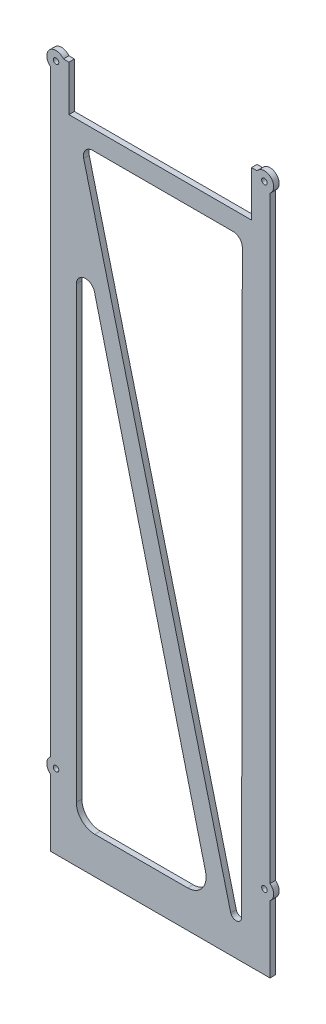
ISO-10303-21;
HEADER;
FILE_DESCRIPTION(('STEP AP214'),'2;1');
FILE_NAME('part.step','',(''),(''),'','','');
FILE_SCHEMA(('AUTOMOTIVE_DESIGN { 1 0 10303 214 1 1 1 1 }'));
ENDSEC;
DATA;
#1=APPLICATION_CONTEXT('core data for automotive mechanical design processes');
#2=APPLICATION_PROTOCOL_DEFINITION('international standard','automotive_design',2000,#1);
#3=PRODUCT_CONTEXT('',#1,'mechanical');
#4=PRODUCT('Part','Part','',(#3));
#5=PRODUCT_RELATED_PRODUCT_CATEGORY('part','',(#4));
#6=PRODUCT_DEFINITION_FORMATION('','',#4);
#7=PRODUCT_DEFINITION_CONTEXT('part definition',#1,'design');
#8=PRODUCT_DEFINITION('design','',#6,#7);
#9=PRODUCT_DEFINITION_SHAPE('','',#8);
#10=(LENGTH_UNIT() NAMED_UNIT(*) SI_UNIT(.MILLI.,.METRE.));
#11=(NAMED_UNIT(*) PLANE_ANGLE_UNIT() SI_UNIT($,.RADIAN.));
#12=(NAMED_UNIT(*) SI_UNIT($,.STERADIAN.) SOLID_ANGLE_UNIT());
#13=UNCERTAINTY_MEASURE_WITH_UNIT(LENGTH_MEASURE(1.E-05),#10,'distance_accuracy_value','');
#14=(GEOMETRIC_REPRESENTATION_CONTEXT(3) GLOBAL_UNCERTAINTY_ASSIGNED_CONTEXT((#13)) GLOBAL_UNIT_ASSIGNED_CONTEXT((#10,
#11,#12)) REPRESENTATION_CONTEXT('',''));
#15=CARTESIAN_POINT('',(0.,0.,0.));
#16=DIRECTION('',(0.,0.,1.));
#17=DIRECTION('',(1.,0.,0.));
#18=AXIS2_PLACEMENT_3D('',#15,#16,#17);
#19=CARTESIAN_POINT('',(0.,-332.18,3.));
#20=DIRECTION('',(0.,0.,-1.));
#21=DIRECTION('',(-1.,0.,0.));
#22=AXIS2_PLACEMENT_3D('',#19,#20,#21);
#23=PLANE('',#22);
#24=CARTESIAN_POINT('',(71.3854792729293,-342.524894505315,3.));
#25=DIRECTION('',(0.,0.,1.));
#26=DIRECTION('',(-1.,0.,0.));
#27=AXIS2_PLACEMENT_3D('',#24,#25,#26);
#28=CIRCLE('',#27,10.);
#29=CARTESIAN_POINT('',(71.3854792729292,-352.524894505315,3.));
#30=VERTEX_POINT('',#29);
#31=CARTESIAN_POINT('',(81.0898729954204,-340.111444178734,3.));
#32=VERTEX_POINT('',#31);
#33=EDGE_CURVE('E282',#30,#32,#28,.T.);
#34=ORIENTED_EDGE('',*,*,#33,.F.);
#35=DIRECTION('',(1.,0.,0.));
#36=VECTOR('',#35,1.);
#37=CARTESIAN_POINT('',(21.0000000000001,-352.524894505315,3.));
#38=LINE('',#37,#36);
#39=CARTESIAN_POINT('',(21.0000000000001,-352.524894505315,3.));
#40=VERTEX_POINT('',#39);
#41=EDGE_CURVE('E299',#40,#30,#38,.T.);
#42=ORIENTED_EDGE('',*,*,#41,.F.);
#43=CARTESIAN_POINT('',(21.,-342.524894505315,3.));
#44=DIRECTION('',(0.,0.,1.));
#45=DIRECTION('',(-1.,0.,0.));
#46=AXIS2_PLACEMENT_3D('',#43,#44,#45);
#47=CIRCLE('',#46,10.);
#48=CARTESIAN_POINT('',(11.,-342.524894505315,3.));
#49=VERTEX_POINT('',#48);
#50=EDGE_CURVE('E295',#49,#40,#47,.T.);
#51=ORIENTED_EDGE('',*,*,#50,.F.);
#52=DIRECTION('',(0.,-1.,0.));
#53=VECTOR('',#52,1.);
#54=CARTESIAN_POINT('',(11.,-99.1045016043882,3.));
#55=LINE('',#54,#53);
#56=CARTESIAN_POINT('',(11.,-99.1045016043882,3.));
#57=VERTEX_POINT('',#56);
#58=EDGE_CURVE('E292',#57,#49,#55,.T.);
#59=ORIENTED_EDGE('',*,*,#58,.F.);
#60=CARTESIAN_POINT('',(16.,-99.1045016043871,3.));
#61=DIRECTION('',(0.,0.,1.));
#62=DIRECTION('',(-1.,0.,0.));
#63=AXIS2_PLACEMENT_3D('',#60,#61,#62);
#64=CIRCLE('',#63,5.);
#65=CARTESIAN_POINT('',(20.8465926277075,-97.8754613686538,3.));
#66=VERTEX_POINT('',#65);
#67=EDGE_CURVE('E289',#66,#57,#64,.T.);
#68=ORIENTED_EDGE('',*,*,#67,.F.);
#69=DIRECTION('',(-0.24134503265812,0.970439372249112,0.));
#70=VECTOR('',#69,1.);
#71=CARTESIAN_POINT('',(81.0898729954204,-340.111444178734,3.));
#72=LINE('',#71,#70);
#73=EDGE_CURVE('E285',#32,#66,#72,.T.);
#74=ORIENTED_EDGE('',*,*,#73,.F.);
#75=EDGE_LOOP('',(#34,#42,#51,#59,#68,#74));
#76=FACE_BOUND('',#75,.T.);
#77=DIRECTION('',(1.,0.,0.));
#78=VECTOR('',#77,1.);
#79=CARTESIAN_POINT('',(116.,-372.501331749397,3.));
#80=LINE('',#79,#78);
#81=CARTESIAN_POINT('',(-3.,-372.501331749397,3.));
#82=VERTEX_POINT('',#81);
#83=CARTESIAN_POINT('',(116.,-372.501331749397,3.));
#84=VERTEX_POINT('',#83);
#85=EDGE_CURVE('E377',#82,#84,#80,.T.);
#86=ORIENTED_EDGE('',*,*,#85,.T.);
#87=DIRECTION('',(0.,1.,0.));
#88=VECTOR('',#87,1.);
#89=CARTESIAN_POINT('',(116.,-372.501331749397,3.));
#90=LINE('',#89,#88);
#91=CARTESIAN_POINT('',(116.,-336.18,3.));
#92=VERTEX_POINT('',#91);
#93=EDGE_CURVE('E381',#84,#92,#90,.T.);
#94=ORIENTED_EDGE('',*,*,#93,.T.);
#95=CARTESIAN_POINT('',(113.,-332.18,3.));
#96=DIRECTION('',(0.,0.,1.));
#97=DIRECTION('',(1.,0.,0.));
#98=AXIS2_PLACEMENT_3D('',#95,#96,#97);
#99=CIRCLE('',#98,5.00000000000002);
#100=CARTESIAN_POINT('',(116.,-328.18,3.));
#101=VERTEX_POINT('',#100);
#102=EDGE_CURVE('E385',#92,#101,#99,.T.);
#103=ORIENTED_EDGE('',*,*,#102,.T.);
#104=DIRECTION('',(0.,1.,0.));
#105=VECTOR('',#104,1.);
#106=CARTESIAN_POINT('',(116.,-328.18,3.));
#107=LINE('',#106,#105);
#108=CARTESIAN_POINT('',(116.,-4.,3.));
#109=VERTEX_POINT('',#108);
#110=EDGE_CURVE('E388',#101,#109,#107,.T.);
#111=ORIENTED_EDGE('',*,*,#110,.T.);
#112=CARTESIAN_POINT('',(113.,0.,3.));
#113=DIRECTION('',(0.,0.,1.));
#114=DIRECTION('',(-1.,0.,0.));
#115=AXIS2_PLACEMENT_3D('',#112,#113,#114);
#116=CIRCLE('',#115,5.);
#117=CARTESIAN_POINT('',(109.,3.,3.));
#118=VERTEX_POINT('',#117);
#119=EDGE_CURVE('E391',#109,#118,#116,.T.);
#120=ORIENTED_EDGE('',*,*,#119,.T.);
#121=DIRECTION('',(-1.,0.,0.));
#122=VECTOR('',#121,1.);
#123=CARTESIAN_POINT('',(106.,3.,3.));
#124=LINE('',#123,#122);
#125=CARTESIAN_POINT('',(106.,3.,3.));
#126=VERTEX_POINT('',#125);
#127=EDGE_CURVE('E394',#118,#126,#124,.T.);
#128=ORIENTED_EDGE('',*,*,#127,.T.);
#129=DIRECTION('',(0.,-1.,0.));
#130=VECTOR('',#129,1.);
#131=CARTESIAN_POINT('',(106.,-21.6457553485476,3.));
#132=LINE('',#131,#130);
#133=CARTESIAN_POINT('',(106.,-21.6457553485476,3.));
#134=VERTEX_POINT('',#133);
#135=EDGE_CURVE('E397',#126,#134,#132,.T.);
#136=ORIENTED_EDGE('',*,*,#135,.T.);
#137=DIRECTION('',(-1.,0.,0.));
#138=VECTOR('',#137,1.);
#139=CARTESIAN_POINT('',(7.,-21.6457553485476,3.));
#140=LINE('',#139,#138);
#141=CARTESIAN_POINT('',(7.,-21.6457553485476,3.));
#142=VERTEX_POINT('',#141);
#143=EDGE_CURVE('E400',#134,#142,#140,.T.);
#144=ORIENTED_EDGE('',*,*,#143,.T.);
#145=DIRECTION('',(0.,1.,0.));
#146=VECTOR('',#145,1.);
#147=CARTESIAN_POINT('',(7.,3.,3.));
#148=LINE('',#147,#146);
#149=CARTESIAN_POINT('',(7.,3.,3.));
#150=VERTEX_POINT('',#149);
#151=EDGE_CURVE('E403',#142,#150,#148,.T.);
#152=ORIENTED_EDGE('',*,*,#151,.T.);
#153=DIRECTION('',(-1.,0.,0.));
#154=VECTOR('',#153,1.);
#155=CARTESIAN_POINT('',(7.,3.,3.));
#156=LINE('',#155,#154);
#157=CARTESIAN_POINT('',(4.,3.,3.));
#158=VERTEX_POINT('',#157);
#159=EDGE_CURVE('E406',#150,#158,#156,.T.);
#160=ORIENTED_EDGE('',*,*,#159,.T.);
#161=CARTESIAN_POINT('',(0.,0.,3.));
#162=DIRECTION('',(0.,0.,1.));
#163=DIRECTION('',(1.,0.,0.));
#164=AXIS2_PLACEMENT_3D('',#161,#162,#163);
#165=CIRCLE('',#164,5.);
#166=CARTESIAN_POINT('',(-3.,-4.,3.));
#167=VERTEX_POINT('',#166);
#168=EDGE_CURVE('E409',#158,#167,#165,.T.);
#169=ORIENTED_EDGE('',*,*,#168,.T.);
#170=DIRECTION('',(0.,-1.,0.));
#171=VECTOR('',#170,1.);
#172=CARTESIAN_POINT('',(-3.,-4.,3.));
#173=LINE('',#172,#171);
#174=CARTESIAN_POINT('',(-3.,-328.18,3.));
#175=VERTEX_POINT('',#174);
#176=EDGE_CURVE('E412',#167,#175,#173,.T.);
#177=ORIENTED_EDGE('',*,*,#176,.T.);
#178=CARTESIAN_POINT('',(0.,-332.18,3.));
#179=DIRECTION('',(0.,0.,1.));
#180=DIRECTION('',(-1.,0.,0.));
#181=AXIS2_PLACEMENT_3D('',#178,#179,#180);
#182=CIRCLE('',#181,4.99999999999995);
#183=CARTESIAN_POINT('',(-3.,-336.18,3.));
#184=VERTEX_POINT('',#183);
#185=EDGE_CURVE('E415',#175,#184,#182,.T.);
#186=ORIENTED_EDGE('',*,*,#185,.T.);
#187=DIRECTION('',(0.,-1.,0.));
#188=VECTOR('',#187,1.);
#189=CARTESIAN_POINT('',(-3.,-336.18,3.));
#190=LINE('',#189,#188);
#191=EDGE_CURVE('E418',#184,#82,#190,.T.);
#192=ORIENTED_EDGE('',*,*,#191,.T.);
#193=EDGE_LOOP('',(#86,#94,#103,#111,#120,#128,#136,#144,#152,#160,#169,#177,#186,#192));
#194=FACE_BOUND('',#193,.T.);
#195=CARTESIAN_POINT('',(0.,0.,3.));
#196=DIRECTION('',(0.,0.,1.));
#197=DIRECTION('',(1.,0.,0.));
#198=AXIS2_PLACEMENT_3D('',#195,#196,#197);
#199=CIRCLE('',#198,1.5);
#200=CARTESIAN_POINT('',(1.5,0.,3.));
#201=VERTEX_POINT('',#200);
#202=EDGE_CURVE('E369',#201,#201,#199,.T.);
#203=ORIENTED_EDGE('',*,*,#202,.F.);
#204=EDGE_LOOP('',(#203));
#205=FACE_BOUND('',#204,.T.);
#206=CARTESIAN_POINT('',(113.,0.,3.));
#207=DIRECTION('',(0.,0.,1.));
#208=DIRECTION('',(1.,0.,0.));
#209=AXIS2_PLACEMENT_3D('',#206,#207,#208);
#210=CIRCLE('',#209,1.5);
#211=CARTESIAN_POINT('',(114.5,0.,3.));
#212=VERTEX_POINT('',#211);
#213=EDGE_CURVE('E361',#212,#212,#210,.T.);
#214=ORIENTED_EDGE('',*,*,#213,.F.);
#215=EDGE_LOOP('',(#214));
#216=FACE_BOUND('',#215,.T.);
#217=CARTESIAN_POINT('',(0.,-332.18,3.));
#218=DIRECTION('',(0.,0.,1.));
#219=DIRECTION('',(1.,0.,0.));
#220=AXIS2_PLACEMENT_3D('',#217,#218,#219);
#221=CIRCLE('',#220,1.5);
#222=CARTESIAN_POINT('',(1.5,-332.18,3.));
#223=VERTEX_POINT('',#222);
#224=EDGE_CURVE('E353',#223,#223,#221,.T.);
#225=ORIENTED_EDGE('',*,*,#224,.F.);
#226=EDGE_LOOP('',(#225));
#227=FACE_BOUND('',#226,.T.);
#228=CARTESIAN_POINT('',(113.,-332.18,3.));
#229=DIRECTION('',(0.,0.,1.));
#230=DIRECTION('',(1.,0.,0.));
#231=AXIS2_PLACEMENT_3D('',#228,#229,#230);
#232=CIRCLE('',#231,1.5);
#233=CARTESIAN_POINT('',(114.5,-332.18,3.));
#234=VERTEX_POINT('',#233);
#235=EDGE_CURVE('E345',#234,#234,#232,.T.);
#236=ORIENTED_EDGE('',*,*,#235,.F.);
#237=EDGE_LOOP('',(#236));
#238=FACE_BOUND('',#237,.T.);
#239=CARTESIAN_POINT('',(95.9881575475294,-37.,3.));
#240=DIRECTION('',(0.,0.,1.));
#241=DIRECTION('',(1.,0.,0.));
#242=AXIS2_PLACEMENT_3D('',#239,#240,#241);
#243=CIRCLE('',#242,5.);
#244=CARTESIAN_POINT('',(100.988154045587,-37.0059177201458,3.));
#245=VERTEX_POINT('',#244);
#246=CARTESIAN_POINT('',(95.9881575475294,-32.,3.));
#247=VERTEX_POINT('',#246);
#248=EDGE_CURVE('E213',#245,#247,#243,.T.);
#249=ORIENTED_EDGE('',*,*,#248,.F.);
#250=DIRECTION('',(0.00118354402914554,0.99999929961152,0.));
#251=VECTOR('',#250,1.);
#252=CARTESIAN_POINT('',(100.988154045587,-37.0059177201458,3.));
#253=LINE('',#252,#251);
#254=CARTESIAN_POINT('',(100.615591755203,-351.791020995962,3.));
#255=VERTEX_POINT('',#254);
#256=EDGE_CURVE('E248',#255,#245,#253,.T.);
#257=ORIENTED_EDGE('',*,*,#256,.F.);
#258=CARTESIAN_POINT('',(97.6155938563681,-351.787470363874,3.));
#259=DIRECTION('',(0.,0.,1.));
#260=DIRECTION('',(-1.,0.,0.));
#261=AXIS2_PLACEMENT_3D('',#258,#259,#260);
#262=CIRCLE('',#261,3.);
#263=CARTESIAN_POINT('',(94.7076382797437,-352.524894505315,3.));
#264=VERTEX_POINT('',#263);
#265=EDGE_CURVE('E245',#264,#255,#262,.T.);
#266=ORIENTED_EDGE('',*,*,#265,.F.);
#267=DIRECTION('',(0.245808047146874,-0.969318525541445,0.));
#268=VECTOR('',#267,1.);
#269=CARTESIAN_POINT('',(94.7076382797437,-352.524894505315,3.));
#270=LINE('',#269,#268);
#271=CARTESIAN_POINT('',(15.0058187759744,-38.2290402357344,3.));
#272=VERTEX_POINT('',#271);
#273=EDGE_CURVE('E240',#272,#264,#270,.T.);
#274=ORIENTED_EDGE('',*,*,#273,.F.);
#275=CARTESIAN_POINT('',(19.8524114036816,-37.,3.));
#276=DIRECTION('',(0.,0.,1.));
#277=DIRECTION('',(-1.,0.,0.));
#278=AXIS2_PLACEMENT_3D('',#275,#276,#277);
#279=CIRCLE('',#278,5.);
#280=CARTESIAN_POINT('',(19.8524114036817,-32.,3.));
#281=VERTEX_POINT('',#280);
#282=EDGE_CURVE('E236',#281,#272,#279,.T.);
#283=ORIENTED_EDGE('',*,*,#282,.F.);
#284=DIRECTION('',(-1.,0.,0.));
#285=VECTOR('',#284,1.);
#286=CARTESIAN_POINT('',(19.8524114036817,-32.,3.));
#287=LINE('',#286,#285);
#288=EDGE_CURVE('E222',#247,#281,#287,.T.);
#289=ORIENTED_EDGE('',*,*,#288,.F.);
#290=EDGE_LOOP('',(#249,#257,#266,#274,#283,#289));
#291=FACE_BOUND('',#290,.T.);
#292=ADVANCED_FACE('F39',(#76,#194,#205,#216,#227,#238,#291),#23,.F.);
#293=CARTESIAN_POINT('',(0.,-332.18,0.));
#294=DIRECTION('',(0.,0.,-1.));
#295=DIRECTION('',(-1.,0.,0.));
#296=AXIS2_PLACEMENT_3D('',#293,#294,#295);
#297=PLANE('',#296);
#298=CARTESIAN_POINT('',(0.,-332.18,0.));
#299=DIRECTION('',(0.,0.,1.));
#300=DIRECTION('',(1.,0.,0.));
#301=AXIS2_PLACEMENT_3D('',#298,#299,#300);
#302=CIRCLE('',#301,1.5);
#303=CARTESIAN_POINT('',(1.5,-332.18,0.));
#304=VERTEX_POINT('',#303);
#305=EDGE_CURVE('E349',#304,#304,#302,.T.);
#306=ORIENTED_EDGE('',*,*,#305,.T.);
#307=EDGE_LOOP('',(#306));
#308=FACE_BOUND('',#307,.T.);
#309=CARTESIAN_POINT('',(0.,0.,0.));
#310=DIRECTION('',(0.,0.,1.));
#311=DIRECTION('',(1.,0.,0.));
#312=AXIS2_PLACEMENT_3D('',#309,#310,#311);
#313=CIRCLE('',#312,1.5);
#314=CARTESIAN_POINT('',(1.5,0.,0.));
#315=VERTEX_POINT('',#314);
#316=EDGE_CURVE('E365',#315,#315,#313,.T.);
#317=ORIENTED_EDGE('',*,*,#316,.T.);
#318=EDGE_LOOP('',(#317));
#319=FACE_BOUND('',#318,.T.);
#320=DIRECTION('',(1.,0.,0.));
#321=VECTOR('',#320,1.);
#322=CARTESIAN_POINT('',(116.,-372.501331749397,0.));
#323=LINE('',#322,#321);
#324=CARTESIAN_POINT('',(-3.,-372.501331749397,0.));
#325=VERTEX_POINT('',#324);
#326=CARTESIAN_POINT('',(116.,-372.501331749397,0.));
#327=VERTEX_POINT('',#326);
#328=EDGE_CURVE('E373',#325,#327,#323,.T.);
#329=ORIENTED_EDGE('',*,*,#328,.F.);
#330=DIRECTION('',(0.,-1.,0.));
#331=VECTOR('',#330,1.);
#332=CARTESIAN_POINT('',(-3.,-336.18,0.));
#333=LINE('',#332,#331);
#334=CARTESIAN_POINT('',(-3.,-336.18,0.));
#335=VERTEX_POINT('',#334);
#336=EDGE_CURVE('E382',#335,#325,#333,.T.);
#337=ORIENTED_EDGE('',*,*,#336,.F.);
#338=CARTESIAN_POINT('',(0.,-332.18,0.));
#339=DIRECTION('',(0.,0.,1.));
#340=DIRECTION('',(-1.,0.,0.));
#341=AXIS2_PLACEMENT_3D('',#338,#339,#340);
#342=CIRCLE('',#341,4.99999999999995);
#343=CARTESIAN_POINT('',(-3.,-328.18,0.));
#344=VERTEX_POINT('',#343);
#345=EDGE_CURVE('E458',#344,#335,#342,.T.);
#346=ORIENTED_EDGE('',*,*,#345,.F.);
#347=DIRECTION('',(0.,-1.,0.));
#348=VECTOR('',#347,1.);
#349=CARTESIAN_POINT('',(-3.,-4.,0.));
#350=LINE('',#349,#348);
#351=CARTESIAN_POINT('',(-3.,-4.,0.));
#352=VERTEX_POINT('',#351);
#353=EDGE_CURVE('E455',#352,#344,#350,.T.);
#354=ORIENTED_EDGE('',*,*,#353,.F.);
#355=CARTESIAN_POINT('',(0.,0.,0.));
#356=DIRECTION('',(0.,0.,1.));
#357=DIRECTION('',(1.,0.,0.));
#358=AXIS2_PLACEMENT_3D('',#355,#356,#357);
#359=CIRCLE('',#358,5.);
#360=CARTESIAN_POINT('',(4.,3.,0.));
#361=VERTEX_POINT('',#360);
#362=EDGE_CURVE('E452',#361,#352,#359,.T.);
#363=ORIENTED_EDGE('',*,*,#362,.F.);
#364=DIRECTION('',(-1.,0.,0.));
#365=VECTOR('',#364,1.);
#366=CARTESIAN_POINT('',(7.,3.,0.));
#367=LINE('',#366,#365);
#368=CARTESIAN_POINT('',(7.,3.,0.));
#369=VERTEX_POINT('',#368);
#370=EDGE_CURVE('E449',#369,#361,#367,.T.);
#371=ORIENTED_EDGE('',*,*,#370,.F.);
#372=DIRECTION('',(0.,1.,0.));
#373=VECTOR('',#372,1.);
#374=CARTESIAN_POINT('',(7.,3.,0.));
#375=LINE('',#374,#373);
#376=CARTESIAN_POINT('',(7.,-21.6457553485476,0.));
#377=VERTEX_POINT('',#376);
#378=EDGE_CURVE('E446',#377,#369,#375,.T.);
#379=ORIENTED_EDGE('',*,*,#378,.F.);
#380=DIRECTION('',(-1.,0.,0.));
#381=VECTOR('',#380,1.);
#382=CARTESIAN_POINT('',(7.,-21.6457553485476,0.));
#383=LINE('',#382,#381);
#384=CARTESIAN_POINT('',(106.,-21.6457553485476,0.));
#385=VERTEX_POINT('',#384);
#386=EDGE_CURVE('E443',#385,#377,#383,.T.);
#387=ORIENTED_EDGE('',*,*,#386,.F.);
#388=DIRECTION('',(0.,-1.,0.));
#389=VECTOR('',#388,1.);
#390=CARTESIAN_POINT('',(106.,-21.6457553485476,0.));
#391=LINE('',#390,#389);
#392=CARTESIAN_POINT('',(106.,3.,0.));
#393=VERTEX_POINT('',#392);
#394=EDGE_CURVE('E440',#393,#385,#391,.T.);
#395=ORIENTED_EDGE('',*,*,#394,.F.);
#396=DIRECTION('',(-1.,0.,0.));
#397=VECTOR('',#396,1.);
#398=CARTESIAN_POINT('',(106.,3.,0.));
#399=LINE('',#398,#397);
#400=CARTESIAN_POINT('',(109.,3.,0.));
#401=VERTEX_POINT('',#400);
#402=EDGE_CURVE('E437',#401,#393,#399,.T.);
#403=ORIENTED_EDGE('',*,*,#402,.F.);
#404=CARTESIAN_POINT('',(113.,0.,0.));
#405=DIRECTION('',(0.,0.,1.));
#406=DIRECTION('',(-1.,0.,0.));
#407=AXIS2_PLACEMENT_3D('',#404,#405,#406);
#408=CIRCLE('',#407,5.);
#409=CARTESIAN_POINT('',(116.,-4.,0.));
#410=VERTEX_POINT('',#409);
#411=EDGE_CURVE('E434',#410,#401,#408,.T.);
#412=ORIENTED_EDGE('',*,*,#411,.F.);
#413=DIRECTION('',(0.,1.,0.));
#414=VECTOR('',#413,1.);
#415=CARTESIAN_POINT('',(116.,-328.18,0.));
#416=LINE('',#415,#414);
#417=CARTESIAN_POINT('',(116.,-328.18,0.));
#418=VERTEX_POINT('',#417);
#419=EDGE_CURVE('E431',#418,#410,#416,.T.);
#420=ORIENTED_EDGE('',*,*,#419,.F.);
#421=CARTESIAN_POINT('',(113.,-332.18,0.));
#422=DIRECTION('',(0.,0.,1.));
#423=DIRECTION('',(1.,0.,0.));
#424=AXIS2_PLACEMENT_3D('',#421,#422,#423);
#425=CIRCLE('',#424,5.00000000000002);
#426=CARTESIAN_POINT('',(116.,-336.18,0.));
#427=VERTEX_POINT('',#426);
#428=EDGE_CURVE('E428',#427,#418,#425,.T.);
#429=ORIENTED_EDGE('',*,*,#428,.F.);
#430=DIRECTION('',(0.,1.,0.));
#431=VECTOR('',#430,1.);
#432=CARTESIAN_POINT('',(116.,-372.501331749397,0.));
#433=LINE('',#432,#431);
#434=EDGE_CURVE('E425',#327,#427,#433,.T.);
#435=ORIENTED_EDGE('',*,*,#434,.F.);
#436=EDGE_LOOP('',(#329,#337,#346,#354,#363,#371,#379,#387,#395,#403,#412,#420,#429,#435));
#437=FACE_BOUND('',#436,.T.);
#438=CARTESIAN_POINT('',(113.,0.,0.));
#439=DIRECTION('',(0.,0.,1.));
#440=DIRECTION('',(1.,0.,0.));
#441=AXIS2_PLACEMENT_3D('',#438,#439,#440);
#442=CIRCLE('',#441,1.5);
#443=CARTESIAN_POINT('',(114.5,0.,0.));
#444=VERTEX_POINT('',#443);
#445=EDGE_CURVE('E357',#444,#444,#442,.T.);
#446=ORIENTED_EDGE('',*,*,#445,.T.);
#447=EDGE_LOOP('',(#446));
#448=FACE_BOUND('',#447,.T.);
#449=CARTESIAN_POINT('',(113.,-332.18,0.));
#450=DIRECTION('',(0.,0.,1.));
#451=DIRECTION('',(1.,0.,0.));
#452=AXIS2_PLACEMENT_3D('',#449,#450,#451);
#453=CIRCLE('',#452,1.5);
#454=CARTESIAN_POINT('',(114.5,-332.18,0.));
#455=VERTEX_POINT('',#454);
#456=EDGE_CURVE('E344',#455,#455,#453,.T.);
#457=ORIENTED_EDGE('',*,*,#456,.T.);
#458=EDGE_LOOP('',(#457));
#459=FACE_BOUND('',#458,.T.);
#460=DIRECTION('',(1.,0.,0.));
#461=VECTOR('',#460,1.);
#462=CARTESIAN_POINT('',(21.0000000000001,-352.524894505315,0.));
#463=LINE('',#462,#461);
#464=CARTESIAN_POINT('',(21.0000000000001,-352.524894505315,0.));
#465=VERTEX_POINT('',#464);
#466=CARTESIAN_POINT('',(71.3854792729292,-352.524894505315,0.));
#467=VERTEX_POINT('',#466);
#468=EDGE_CURVE('E286',#465,#467,#463,.T.);
#469=ORIENTED_EDGE('',*,*,#468,.T.);
#470=CARTESIAN_POINT('',(71.3854792729293,-342.524894505315,0.));
#471=DIRECTION('',(0.,0.,1.));
#472=DIRECTION('',(-1.,0.,0.));
#473=AXIS2_PLACEMENT_3D('',#470,#471,#472);
#474=CIRCLE('',#473,10.);
#475=CARTESIAN_POINT('',(81.0898729954204,-340.111444178734,0.));
#476=VERTEX_POINT('',#475);
#477=EDGE_CURVE('E231',#467,#476,#474,.T.);
#478=ORIENTED_EDGE('',*,*,#477,.T.);
#479=DIRECTION('',(-0.24134503265812,0.970439372249112,0.));
#480=VECTOR('',#479,1.);
#481=CARTESIAN_POINT('',(81.0898729954204,-340.111444178734,0.));
#482=LINE('',#481,#480);
#483=CARTESIAN_POINT('',(20.8465926277075,-97.8754613686538,0.));
#484=VERTEX_POINT('',#483);
#485=EDGE_CURVE('E306',#476,#484,#482,.T.);
#486=ORIENTED_EDGE('',*,*,#485,.T.);
#487=CARTESIAN_POINT('',(16.,-99.1045016043871,0.));
#488=DIRECTION('',(0.,0.,1.));
#489=DIRECTION('',(-1.,0.,0.));
#490=AXIS2_PLACEMENT_3D('',#487,#488,#489);
#491=CIRCLE('',#490,5.);
#492=CARTESIAN_POINT('',(11.,-99.1045016043882,0.));
#493=VERTEX_POINT('',#492);
#494=EDGE_CURVE('E310',#484,#493,#491,.T.);
#495=ORIENTED_EDGE('',*,*,#494,.T.);
#496=DIRECTION('',(0.,-1.,0.));
#497=VECTOR('',#496,1.);
#498=CARTESIAN_POINT('',(11.,-99.1045016043882,0.));
#499=LINE('',#498,#497);
#500=CARTESIAN_POINT('',(11.,-342.524894505315,0.));
#501=VERTEX_POINT('',#500);
#502=EDGE_CURVE('E314',#493,#501,#499,.T.);
#503=ORIENTED_EDGE('',*,*,#502,.T.);
#504=CARTESIAN_POINT('',(21.,-342.524894505315,0.));
#505=DIRECTION('',(0.,0.,1.));
#506=DIRECTION('',(-1.,0.,0.));
#507=AXIS2_PLACEMENT_3D('',#504,#505,#506);
#508=CIRCLE('',#507,10.);
#509=EDGE_CURVE('E318',#501,#465,#508,.T.);
#510=ORIENTED_EDGE('',*,*,#509,.T.);
#511=EDGE_LOOP('',(#469,#478,#486,#495,#503,#510));
#512=FACE_BOUND('',#511,.T.);
#513=DIRECTION('',(0.00118354402914554,0.99999929961152,0.));
#514=VECTOR('',#513,1.);
#515=CARTESIAN_POINT('',(100.988154045587,-37.0059177201458,0.));
#516=LINE('',#515,#514);
#517=CARTESIAN_POINT('',(100.615591755203,-351.791020995962,0.));
#518=VERTEX_POINT('',#517);
#519=CARTESIAN_POINT('',(100.988154045587,-37.0059177201457,0.));
#520=VERTEX_POINT('',#519);
#521=EDGE_CURVE('E223',#518,#520,#516,.T.);
#522=ORIENTED_EDGE('',*,*,#521,.T.);
#523=CARTESIAN_POINT('',(95.9881575475294,-37.,0.));
#524=DIRECTION('',(0.,0.,1.));
#525=DIRECTION('',(1.,0.,0.));
#526=AXIS2_PLACEMENT_3D('',#523,#524,#525);
#527=CIRCLE('',#526,5.);
#528=CARTESIAN_POINT('',(95.9881575475294,-32.,0.));
#529=VERTEX_POINT('',#528);
#530=EDGE_CURVE('E63',#520,#529,#527,.T.);
#531=ORIENTED_EDGE('',*,*,#530,.T.);
#532=DIRECTION('',(-1.,0.,0.));
#533=VECTOR('',#532,1.);
#534=CARTESIAN_POINT('',(19.8524114036817,-32.,0.));
#535=LINE('',#534,#533);
#536=CARTESIAN_POINT('',(19.8524114036817,-32.,0.));
#537=VERTEX_POINT('',#536);
#538=EDGE_CURVE('E229',#529,#537,#535,.T.);
#539=ORIENTED_EDGE('',*,*,#538,.T.);
#540=CARTESIAN_POINT('',(19.8524114036816,-37.,0.));
#541=DIRECTION('',(0.,0.,1.));
#542=DIRECTION('',(-1.,0.,0.));
#543=AXIS2_PLACEMENT_3D('',#540,#541,#542);
#544=CIRCLE('',#543,5.);
#545=CARTESIAN_POINT('',(15.0058187759744,-38.2290402357344,0.));
#546=VERTEX_POINT('',#545);
#547=EDGE_CURVE('E255',#537,#546,#544,.T.);
#548=ORIENTED_EDGE('',*,*,#547,.T.);
#549=DIRECTION('',(0.245808047146874,-0.969318525541445,0.));
#550=VECTOR('',#549,1.);
#551=CARTESIAN_POINT('',(94.7076382797437,-352.524894505315,0.));
#552=LINE('',#551,#550);
#553=CARTESIAN_POINT('',(94.7076382797437,-352.524894505315,0.));
#554=VERTEX_POINT('',#553);
#555=EDGE_CURVE('E259',#546,#554,#552,.T.);
#556=ORIENTED_EDGE('',*,*,#555,.T.);
#557=CARTESIAN_POINT('',(97.6155938563681,-351.787470363874,0.));
#558=DIRECTION('',(0.,0.,1.));
#559=DIRECTION('',(-1.,0.,0.));
#560=AXIS2_PLACEMENT_3D('',#557,#558,#559);
#561=CIRCLE('',#560,3.);
#562=EDGE_CURVE('E263',#554,#518,#561,.T.);
#563=ORIENTED_EDGE('',*,*,#562,.T.);
#564=EDGE_LOOP('',(#522,#531,#539,#548,#556,#563));
#565=FACE_BOUND('',#564,.T.);
#566=ADVANCED_FACE('F521',(#308,#319,#437,#448,#459,#512,#565),#297,.T.);
#567=CARTESIAN_POINT('',(116.,-372.501331749397,3.));
#568=DIRECTION('',(0.,1.,0.));
#569=DIRECTION('',(0.,0.,1.));
#570=AXIS2_PLACEMENT_3D('',#567,#568,#569);
#571=PLANE('',#570);
#572=ORIENTED_EDGE('',*,*,#328,.T.);
#573=DIRECTION('',(0.,0.,-1.));
#574=VECTOR('',#573,1.);
#575=CARTESIAN_POINT('',(116.,-372.501331749397,3.));
#576=LINE('',#575,#574);
#577=EDGE_CURVE('E11',#84,#327,#576,.T.);
#578=ORIENTED_EDGE('',*,*,#577,.F.);
#579=ORIENTED_EDGE('',*,*,#85,.F.);
#580=DIRECTION('',(0.,0.,-1.));
#581=VECTOR('',#580,1.);
#582=CARTESIAN_POINT('',(-3.,-372.501331749397,3.));
#583=LINE('',#582,#581);
#584=EDGE_CURVE('E421',#82,#325,#583,.T.);
#585=ORIENTED_EDGE('',*,*,#584,.T.);
#586=EDGE_LOOP('',(#572,#578,#579,#585));
#587=FACE_BOUND('',#586,.T.);
#588=ADVANCED_FACE('F41',(#587),#571,.F.);
#589=CARTESIAN_POINT('',(116.,-372.501331749397,3.));
#590=DIRECTION('',(-1.,0.,0.));
#591=DIRECTION('',(0.,0.,1.));
#592=AXIS2_PLACEMENT_3D('',#589,#590,#591);
#593=PLANE('',#592);
#594=ORIENTED_EDGE('',*,*,#434,.T.);
#595=DIRECTION('',(0.,0.,-1.));
#596=VECTOR('',#595,1.);
#597=CARTESIAN_POINT('',(116.,-336.18,3.));
#598=LINE('',#597,#596);
#599=EDGE_CURVE('E48',#92,#427,#598,.T.);
#600=ORIENTED_EDGE('',*,*,#599,.F.);
#601=ORIENTED_EDGE('',*,*,#93,.F.);
#602=ORIENTED_EDGE('',*,*,#577,.T.);
#603=EDGE_LOOP('',(#594,#600,#601,#602));
#604=FACE_BOUND('',#603,.T.);
#605=ADVANCED_FACE('F539',(#604),#593,.F.);
#606=CARTESIAN_POINT('',(113.,-332.18,3.));
#607=DIRECTION('',(0.,0.,-1.));
#608=DIRECTION('',(-1.,0.,0.));
#609=AXIS2_PLACEMENT_3D('',#606,#607,#608);
#610=CYLINDRICAL_SURFACE('',#609,5.00000000000002);
#611=ORIENTED_EDGE('',*,*,#428,.T.);
#612=DIRECTION('',(0.,0.,-1.));
#613=VECTOR('',#612,1.);
#614=CARTESIAN_POINT('',(116.,-328.18,3.));
#615=LINE('',#614,#613);
#616=EDGE_CURVE('E506',#101,#418,#615,.T.);
#617=ORIENTED_EDGE('',*,*,#616,.F.);
#618=ORIENTED_EDGE('',*,*,#102,.F.);
#619=ORIENTED_EDGE('',*,*,#599,.T.);
#620=EDGE_LOOP('',(#611,#617,#618,#619));
#621=FACE_BOUND('',#620,.T.);
#622=ADVANCED_FACE('F515',(#621),#610,.T.);
#623=CARTESIAN_POINT('',(116.,-328.18,3.));
#624=DIRECTION('',(-1.,0.,0.));
#625=DIRECTION('',(0.,-1.,0.));
#626=AXIS2_PLACEMENT_3D('',#623,#624,#625);
#627=PLANE('',#626);
#628=ORIENTED_EDGE('',*,*,#419,.T.);
#629=DIRECTION('',(0.,0.,-1.));
#630=VECTOR('',#629,1.);
#631=CARTESIAN_POINT('',(116.,-4.,3.));
#632=LINE('',#631,#630);
#633=EDGE_CURVE('E502',#109,#410,#632,.T.);
#634=ORIENTED_EDGE('',*,*,#633,.F.);
#635=ORIENTED_EDGE('',*,*,#110,.F.);
#636=ORIENTED_EDGE('',*,*,#616,.T.);
#637=EDGE_LOOP('',(#628,#634,#635,#636));
#638=FACE_BOUND('',#637,.T.);
#639=ADVANCED_FACE('F527',(#638),#627,.F.);
#640=CARTESIAN_POINT('',(113.,0.,3.));
#641=DIRECTION('',(0.,0.,-1.));
#642=DIRECTION('',(-1.,0.,0.));
#643=AXIS2_PLACEMENT_3D('',#640,#641,#642);
#644=CYLINDRICAL_SURFACE('',#643,5.);
#645=ORIENTED_EDGE('',*,*,#411,.T.);
#646=DIRECTION('',(0.,0.,-1.));
#647=VECTOR('',#646,1.);
#648=CARTESIAN_POINT('',(109.,3.,3.));
#649=LINE('',#648,#647);
#650=EDGE_CURVE('E498',#118,#401,#649,.T.);
#651=ORIENTED_EDGE('',*,*,#650,.F.);
#652=ORIENTED_EDGE('',*,*,#119,.F.);
#653=ORIENTED_EDGE('',*,*,#633,.T.);
#654=EDGE_LOOP('',(#645,#651,#652,#653));
#655=FACE_BOUND('',#654,.T.);
#656=ADVANCED_FACE('F531',(#655),#644,.T.);
#657=CARTESIAN_POINT('',(106.,3.,3.));
#658=DIRECTION('',(0.,-1.,0.));
#659=DIRECTION('',(1.,0.,0.));
#660=AXIS2_PLACEMENT_3D('',#657,#658,#659);
#661=PLANE('',#660);
#662=ORIENTED_EDGE('',*,*,#402,.T.);
#663=DIRECTION('',(0.,0.,-1.));
#664=VECTOR('',#663,1.);
#665=CARTESIAN_POINT('',(106.,3.,3.));
#666=LINE('',#665,#664);
#667=EDGE_CURVE('E494',#126,#393,#666,.T.);
#668=ORIENTED_EDGE('',*,*,#667,.F.);
#669=ORIENTED_EDGE('',*,*,#127,.F.);
#670=ORIENTED_EDGE('',*,*,#650,.T.);
#671=EDGE_LOOP('',(#662,#668,#669,#670));
#672=FACE_BOUND('',#671,.T.);
#673=ADVANCED_FACE('F582',(#672),#661,.F.);
#674=CARTESIAN_POINT('',(106.,-21.6457553485476,3.));
#675=DIRECTION('',(1.,0.,0.));
#676=DIRECTION('',(0.,0.,-1.));
#677=AXIS2_PLACEMENT_3D('',#674,#675,#676);
#678=PLANE('',#677);
#679=ORIENTED_EDGE('',*,*,#394,.T.);
#680=DIRECTION('',(0.,0.,-1.));
#681=VECTOR('',#680,1.);
#682=CARTESIAN_POINT('',(106.,-21.6457553485476,3.));
#683=LINE('',#682,#681);
#684=EDGE_CURVE('E490',#134,#385,#683,.T.);
#685=ORIENTED_EDGE('',*,*,#684,.F.);
#686=ORIENTED_EDGE('',*,*,#135,.F.);
#687=ORIENTED_EDGE('',*,*,#667,.T.);
#688=EDGE_LOOP('',(#679,#685,#686,#687));
#689=FACE_BOUND('',#688,.T.);
#690=ADVANCED_FACE('F580',(#689),#678,.F.);
#691=CARTESIAN_POINT('',(7.,-21.6457553485476,3.));
#692=DIRECTION('',(0.,-1.,0.));
#693=DIRECTION('',(0.,0.,-1.));
#694=AXIS2_PLACEMENT_3D('',#691,#692,#693);
#695=PLANE('',#694);
#696=ORIENTED_EDGE('',*,*,#386,.T.);
#697=DIRECTION('',(0.,0.,-1.));
#698=VECTOR('',#697,1.);
#699=CARTESIAN_POINT('',(7.,-21.6457553485476,3.));
#700=LINE('',#699,#698);
#701=EDGE_CURVE('E486',#142,#377,#700,.T.);
#702=ORIENTED_EDGE('',*,*,#701,.F.);
#703=ORIENTED_EDGE('',*,*,#143,.F.);
#704=ORIENTED_EDGE('',*,*,#684,.T.);
#705=EDGE_LOOP('',(#696,#702,#703,#704));
#706=FACE_BOUND('',#705,.T.);
#707=ADVANCED_FACE('F575',(#706),#695,.F.);
#708=CARTESIAN_POINT('',(7.,3.,3.));
#709=DIRECTION('',(-1.,0.,0.));
#710=DIRECTION('',(0.,0.,1.));
#711=AXIS2_PLACEMENT_3D('',#708,#709,#710);
#712=PLANE('',#711);
#713=ORIENTED_EDGE('',*,*,#378,.T.);
#714=DIRECTION('',(0.,0.,-1.));
#715=VECTOR('',#714,1.);
#716=CARTESIAN_POINT('',(7.,3.,3.));
#717=LINE('',#716,#715);
#718=EDGE_CURVE('E482',#150,#369,#717,.T.);
#719=ORIENTED_EDGE('',*,*,#718,.F.);
#720=ORIENTED_EDGE('',*,*,#151,.F.);
#721=ORIENTED_EDGE('',*,*,#701,.T.);
#722=EDGE_LOOP('',(#713,#719,#720,#721));
#723=FACE_BOUND('',#722,.T.);
#724=ADVANCED_FACE('F570',(#723),#712,.F.);
#725=CARTESIAN_POINT('',(7.,3.,3.));
#726=DIRECTION('',(0.,-1.,0.));
#727=DIRECTION('',(1.,0.,0.));
#728=AXIS2_PLACEMENT_3D('',#725,#726,#727);
#729=PLANE('',#728);
#730=ORIENTED_EDGE('',*,*,#370,.T.);
#731=DIRECTION('',(0.,0.,-1.));
#732=VECTOR('',#731,1.);
#733=CARTESIAN_POINT('',(4.,3.,3.));
#734=LINE('',#733,#732);
#735=EDGE_CURVE('E478',#158,#361,#734,.T.);
#736=ORIENTED_EDGE('',*,*,#735,.F.);
#737=ORIENTED_EDGE('',*,*,#159,.F.);
#738=ORIENTED_EDGE('',*,*,#718,.T.);
#739=EDGE_LOOP('',(#730,#736,#737,#738));
#740=FACE_BOUND('',#739,.T.);
#741=ADVANCED_FACE('F566',(#740),#729,.F.);
#742=CARTESIAN_POINT('',(0.,0.,3.));
#743=DIRECTION('',(0.,0.,-1.));
#744=DIRECTION('',(-1.,0.,0.));
#745=AXIS2_PLACEMENT_3D('',#742,#743,#744);
#746=CYLINDRICAL_SURFACE('',#745,5.);
#747=ORIENTED_EDGE('',*,*,#362,.T.);
#748=DIRECTION('',(0.,0.,-1.));
#749=VECTOR('',#748,1.);
#750=CARTESIAN_POINT('',(-3.,-4.,3.));
#751=LINE('',#750,#749);
#752=EDGE_CURVE('E474',#167,#352,#751,.T.);
#753=ORIENTED_EDGE('',*,*,#752,.F.);
#754=ORIENTED_EDGE('',*,*,#168,.F.);
#755=ORIENTED_EDGE('',*,*,#735,.T.);
#756=EDGE_LOOP('',(#747,#753,#754,#755));
#757=FACE_BOUND('',#756,.T.);
#758=ADVANCED_FACE('F561',(#757),#746,.T.);
#759=CARTESIAN_POINT('',(-3.,-4.,3.));
#760=DIRECTION('',(1.,0.,0.));
#761=DIRECTION('',(0.,1.,0.));
#762=AXIS2_PLACEMENT_3D('',#759,#760,#761);
#763=PLANE('',#762);
#764=ORIENTED_EDGE('',*,*,#353,.T.);
#765=DIRECTION('',(0.,0.,-1.));
#766=VECTOR('',#765,1.);
#767=CARTESIAN_POINT('',(-3.,-328.18,3.));
#768=LINE('',#767,#766);
#769=EDGE_CURVE('E470',#175,#344,#768,.T.);
#770=ORIENTED_EDGE('',*,*,#769,.F.);
#771=ORIENTED_EDGE('',*,*,#176,.F.);
#772=ORIENTED_EDGE('',*,*,#752,.T.);
#773=EDGE_LOOP('',(#764,#770,#771,#772));
#774=FACE_BOUND('',#773,.T.);
#775=ADVANCED_FACE('F555',(#774),#763,.F.);
#776=CARTESIAN_POINT('',(0.,-332.18,3.));
#777=DIRECTION('',(0.,0.,-1.));
#778=DIRECTION('',(-1.,0.,0.));
#779=AXIS2_PLACEMENT_3D('',#776,#777,#778);
#780=CYLINDRICAL_SURFACE('',#779,4.99999999999995);
#781=ORIENTED_EDGE('',*,*,#345,.T.);
#782=DIRECTION('',(0.,0.,-1.));
#783=VECTOR('',#782,1.);
#784=CARTESIAN_POINT('',(-3.,-336.18,3.));
#785=LINE('',#784,#783);
#786=EDGE_CURVE('E466',#184,#335,#785,.T.);
#787=ORIENTED_EDGE('',*,*,#786,.F.);
#788=ORIENTED_EDGE('',*,*,#185,.F.);
#789=ORIENTED_EDGE('',*,*,#769,.T.);
#790=EDGE_LOOP('',(#781,#787,#788,#789));
#791=FACE_BOUND('',#790,.T.);
#792=ADVANCED_FACE('F551',(#791),#780,.T.);
#793=CARTESIAN_POINT('',(-3.,-336.18,3.));
#794=DIRECTION('',(1.,0.,0.));
#795=DIRECTION('',(0.,0.,-1.));
#796=AXIS2_PLACEMENT_3D('',#793,#794,#795);
#797=PLANE('',#796);
#798=ORIENTED_EDGE('',*,*,#336,.T.);
#799=ORIENTED_EDGE('',*,*,#584,.F.);
#800=ORIENTED_EDGE('',*,*,#191,.F.);
#801=ORIENTED_EDGE('',*,*,#786,.T.);
#802=EDGE_LOOP('',(#798,#799,#800,#801));
#803=FACE_BOUND('',#802,.T.);
#804=ADVANCED_FACE('F546',(#803),#797,.F.);
#805=CARTESIAN_POINT('',(0.,0.,3.));
#806=DIRECTION('',(0.,0.,-1.));
#807=DIRECTION('',(-1.,0.,0.));
#808=AXIS2_PLACEMENT_3D('',#805,#806,#807);
#809=CYLINDRICAL_SURFACE('',#808,1.5);
#810=ORIENTED_EDGE('',*,*,#202,.T.);
#811=EDGE_LOOP('',(#810));
#812=FACE_BOUND('',#811,.T.);
#813=ORIENTED_EDGE('',*,*,#316,.F.);
#814=EDGE_LOOP('',(#813));
#815=FACE_BOUND('',#814,.T.);
#816=ADVANCED_FACE('F601',(#812,#815),#809,.F.);
#817=CARTESIAN_POINT('',(113.,0.,3.));
#818=DIRECTION('',(0.,0.,-1.));
#819=DIRECTION('',(-1.,0.,0.));
#820=AXIS2_PLACEMENT_3D('',#817,#818,#819);
#821=CYLINDRICAL_SURFACE('',#820,1.5);
#822=ORIENTED_EDGE('',*,*,#213,.T.);
#823=EDGE_LOOP('',(#822));
#824=FACE_BOUND('',#823,.T.);
#825=ORIENTED_EDGE('',*,*,#445,.F.);
#826=EDGE_LOOP('',(#825));
#827=FACE_BOUND('',#826,.T.);
#828=ADVANCED_FACE('F651',(#824,#827),#821,.F.);
#829=CARTESIAN_POINT('',(0.,-332.18,3.));
#830=DIRECTION('',(0.,0.,-1.));
#831=DIRECTION('',(-1.,0.,0.));
#832=AXIS2_PLACEMENT_3D('',#829,#830,#831);
#833=CYLINDRICAL_SURFACE('',#832,1.5);
#834=ORIENTED_EDGE('',*,*,#224,.T.);
#835=EDGE_LOOP('',(#834));
#836=FACE_BOUND('',#835,.T.);
#837=ORIENTED_EDGE('',*,*,#305,.F.);
#838=EDGE_LOOP('',(#837));
#839=FACE_BOUND('',#838,.T.);
#840=ADVANCED_FACE('F658',(#836,#839),#833,.F.);
#841=CARTESIAN_POINT('',(113.,-332.18,3.));
#842=DIRECTION('',(0.,0.,-1.));
#843=DIRECTION('',(-1.,0.,0.));
#844=AXIS2_PLACEMENT_3D('',#841,#842,#843);
#845=CYLINDRICAL_SURFACE('',#844,1.5);
#846=ORIENTED_EDGE('',*,*,#235,.T.);
#847=EDGE_LOOP('',(#846));
#848=FACE_BOUND('',#847,.T.);
#849=ORIENTED_EDGE('',*,*,#456,.F.);
#850=EDGE_LOOP('',(#849));
#851=FACE_BOUND('',#850,.T.);
#852=ADVANCED_FACE('F665',(#848,#851),#845,.F.);
#853=CARTESIAN_POINT('',(71.3854792729293,-342.524894505315,3.));
#854=DIRECTION('',(0.,0.,-1.));
#855=DIRECTION('',(-1.,0.,0.));
#856=AXIS2_PLACEMENT_3D('',#853,#854,#855);
#857=CYLINDRICAL_SURFACE('',#856,10.);
#858=ORIENTED_EDGE('',*,*,#477,.F.);
#859=DIRECTION('',(0.,0.,-1.));
#860=VECTOR('',#859,1.);
#861=CARTESIAN_POINT('',(71.3854792729292,-352.524894505315,3.));
#862=LINE('',#861,#860);
#863=EDGE_CURVE('E302',#30,#467,#862,.T.);
#864=ORIENTED_EDGE('',*,*,#863,.F.);
#865=ORIENTED_EDGE('',*,*,#33,.T.);
#866=DIRECTION('',(0.,0.,-1.));
#867=VECTOR('',#866,1.);
#868=CARTESIAN_POINT('',(81.0898729954204,-340.111444178734,3.));
#869=LINE('',#868,#867);
#870=EDGE_CURVE('E340',#32,#476,#869,.T.);
#871=ORIENTED_EDGE('',*,*,#870,.T.);
#872=EDGE_LOOP('',(#858,#864,#865,#871));
#873=FACE_BOUND('',#872,.T.);
#874=ADVANCED_FACE('F673',(#873),#857,.F.);
#875=CARTESIAN_POINT('',(81.0898729954204,-340.111444178734,3.));
#876=DIRECTION('',(-0.970439372249112,-0.24134503265812,0.));
#877=DIRECTION('',(0.24134503265812,-0.970439372249112,0.));
#878=AXIS2_PLACEMENT_3D('',#875,#876,#877);
#879=PLANE('',#878);
#880=ORIENTED_EDGE('',*,*,#485,.F.);
#881=ORIENTED_EDGE('',*,*,#870,.F.);
#882=ORIENTED_EDGE('',*,*,#73,.T.);
#883=DIRECTION('',(0.,0.,-1.));
#884=VECTOR('',#883,1.);
#885=CARTESIAN_POINT('',(20.8465926277075,-97.8754613686538,3.));
#886=LINE('',#885,#884);
#887=EDGE_CURVE('E337',#66,#484,#886,.T.);
#888=ORIENTED_EDGE('',*,*,#887,.T.);
#889=EDGE_LOOP('',(#880,#881,#882,#888));
#890=FACE_BOUND('',#889,.T.);
#891=ADVANCED_FACE('F681',(#890),#879,.T.);
#892=CARTESIAN_POINT('',(16.,-99.1045016043871,3.));
#893=DIRECTION('',(0.,0.,-1.));
#894=DIRECTION('',(-1.,0.,0.));
#895=AXIS2_PLACEMENT_3D('',#892,#893,#894);
#896=CYLINDRICAL_SURFACE('',#895,5.);
#897=ORIENTED_EDGE('',*,*,#494,.F.);
#898=ORIENTED_EDGE('',*,*,#887,.F.);
#899=ORIENTED_EDGE('',*,*,#67,.T.);
#900=DIRECTION('',(0.,0.,-1.));
#901=VECTOR('',#900,1.);
#902=CARTESIAN_POINT('',(11.,-99.1045016043882,3.));
#903=LINE('',#902,#901);
#904=EDGE_CURVE('E334',#57,#493,#903,.T.);
#905=ORIENTED_EDGE('',*,*,#904,.T.);
#906=EDGE_LOOP('',(#897,#898,#899,#905));
#907=FACE_BOUND('',#906,.T.);
#908=ADVANCED_FACE('F689',(#907),#896,.F.);
#909=CARTESIAN_POINT('',(11.,-99.1045016043882,3.));
#910=DIRECTION('',(1.,0.,0.));
#911=DIRECTION('',(0.,1.,0.));
#912=AXIS2_PLACEMENT_3D('',#909,#910,#911);
#913=PLANE('',#912);
#914=ORIENTED_EDGE('',*,*,#502,.F.);
#915=ORIENTED_EDGE('',*,*,#904,.F.);
#916=ORIENTED_EDGE('',*,*,#58,.T.);
#917=DIRECTION('',(0.,0.,-1.));
#918=VECTOR('',#917,1.);
#919=CARTESIAN_POINT('',(11.,-342.524894505315,3.));
#920=LINE('',#919,#918);
#921=EDGE_CURVE('E331',#49,#501,#920,.T.);
#922=ORIENTED_EDGE('',*,*,#921,.T.);
#923=EDGE_LOOP('',(#914,#915,#916,#922));
#924=FACE_BOUND('',#923,.T.);
#925=ADVANCED_FACE('F697',(#924),#913,.T.);
#926=CARTESIAN_POINT('',(21.,-342.524894505315,3.));
#927=DIRECTION('',(0.,0.,-1.));
#928=DIRECTION('',(-1.,0.,0.));
#929=AXIS2_PLACEMENT_3D('',#926,#927,#928);
#930=CYLINDRICAL_SURFACE('',#929,10.);
#931=ORIENTED_EDGE('',*,*,#509,.F.);
#932=ORIENTED_EDGE('',*,*,#921,.F.);
#933=ORIENTED_EDGE('',*,*,#50,.T.);
#934=DIRECTION('',(0.,0.,-1.));
#935=VECTOR('',#934,1.);
#936=CARTESIAN_POINT('',(21.0000000000001,-352.524894505315,3.));
#937=LINE('',#936,#935);
#938=EDGE_CURVE('E328',#40,#465,#937,.T.);
#939=ORIENTED_EDGE('',*,*,#938,.T.);
#940=EDGE_LOOP('',(#931,#932,#933,#939));
#941=FACE_BOUND('',#940,.T.);
#942=ADVANCED_FACE('F705',(#941),#930,.F.);
#943=CARTESIAN_POINT('',(21.0000000000001,-352.524894505315,3.));
#944=DIRECTION('',(0.,1.,0.));
#945=DIRECTION('',(0.,0.,1.));
#946=AXIS2_PLACEMENT_3D('',#943,#944,#945);
#947=PLANE('',#946);
#948=ORIENTED_EDGE('',*,*,#468,.F.);
#949=ORIENTED_EDGE('',*,*,#938,.F.);
#950=ORIENTED_EDGE('',*,*,#41,.T.);
#951=ORIENTED_EDGE('',*,*,#863,.T.);
#952=EDGE_LOOP('',(#948,#949,#950,#951));
#953=FACE_BOUND('',#952,.T.);
#954=ADVANCED_FACE('F713',(#953),#947,.T.);
#955=CARTESIAN_POINT('',(95.9881575475294,-37.,3.));
#956=DIRECTION('',(0.,0.,-1.));
#957=DIRECTION('',(-1.,0.,0.));
#958=AXIS2_PLACEMENT_3D('',#955,#956,#957);
#959=CYLINDRICAL_SURFACE('',#958,5.);
#960=ORIENTED_EDGE('',*,*,#530,.F.);
#961=DIRECTION('',(0.,0.,-1.));
#962=VECTOR('',#961,1.);
#963=CARTESIAN_POINT('',(100.988154045587,-37.0059177201458,3.));
#964=LINE('',#963,#962);
#965=EDGE_CURVE('E217',#245,#520,#964,.T.);
#966=ORIENTED_EDGE('',*,*,#965,.F.);
#967=ORIENTED_EDGE('',*,*,#248,.T.);
#968=DIRECTION('',(0.,0.,-1.));
#969=VECTOR('',#968,1.);
#970=CARTESIAN_POINT('',(95.9881575475294,-32.,3.));
#971=LINE('',#970,#969);
#972=EDGE_CURVE('E216',#247,#529,#971,.T.);
#973=ORIENTED_EDGE('',*,*,#972,.T.);
#974=EDGE_LOOP('',(#960,#966,#967,#973));
#975=FACE_BOUND('',#974,.T.);
#976=ADVANCED_FACE('F215',(#975),#959,.F.);
#977=CARTESIAN_POINT('',(19.8524114036817,-32.,3.));
#978=DIRECTION('',(0.,-1.,0.));
#979=DIRECTION('',(1.,0.,0.));
#980=AXIS2_PLACEMENT_3D('',#977,#978,#979);
#981=PLANE('',#980);
#982=ORIENTED_EDGE('',*,*,#538,.F.);
#983=ORIENTED_EDGE('',*,*,#972,.F.);
#984=ORIENTED_EDGE('',*,*,#288,.T.);
#985=DIRECTION('',(0.,0.,-1.));
#986=VECTOR('',#985,1.);
#987=CARTESIAN_POINT('',(19.8524114036817,-32.,3.));
#988=LINE('',#987,#986);
#989=EDGE_CURVE('E232',#281,#537,#988,.T.);
#990=ORIENTED_EDGE('',*,*,#989,.T.);
#991=EDGE_LOOP('',(#982,#983,#984,#990));
#992=FACE_BOUND('',#991,.T.);
#993=ADVANCED_FACE('F226',(#992),#981,.T.);
#994=CARTESIAN_POINT('',(19.8524114036816,-37.,3.));
#995=DIRECTION('',(0.,0.,-1.));
#996=DIRECTION('',(-1.,0.,0.));
#997=AXIS2_PLACEMENT_3D('',#994,#995,#996);
#998=CYLINDRICAL_SURFACE('',#997,5.);
#999=ORIENTED_EDGE('',*,*,#547,.F.);
#1000=ORIENTED_EDGE('',*,*,#989,.F.);
#1001=ORIENTED_EDGE('',*,*,#282,.T.);
#1002=DIRECTION('',(0.,0.,-1.));
#1003=VECTOR('',#1002,1.);
#1004=CARTESIAN_POINT('',(15.0058187759744,-38.2290402357344,3.));
#1005=LINE('',#1004,#1003);
#1006=EDGE_CURVE('E277',#272,#546,#1005,.T.);
#1007=ORIENTED_EDGE('',*,*,#1006,.T.);
#1008=EDGE_LOOP('',(#999,#1000,#1001,#1007));
#1009=FACE_BOUND('',#1008,.T.);
#1010=ADVANCED_FACE('F734',(#1009),#998,.F.);
#1011=CARTESIAN_POINT('',(94.7076382797437,-352.524894505315,3.));
#1012=DIRECTION('',(0.969318525541445,0.245808047146874,0.));
#1013=DIRECTION('',(-0.245808047146874,0.969318525541445,0.));
#1014=AXIS2_PLACEMENT_3D('',#1011,#1012,#1013);
#1015=PLANE('',#1014);
#1016=ORIENTED_EDGE('',*,*,#555,.F.);
#1017=ORIENTED_EDGE('',*,*,#1006,.F.);
#1018=ORIENTED_EDGE('',*,*,#273,.T.);
#1019=DIRECTION('',(0.,0.,-1.));
#1020=VECTOR('',#1019,1.);
#1021=CARTESIAN_POINT('',(94.7076382797437,-352.524894505315,3.));
#1022=LINE('',#1021,#1020);
#1023=EDGE_CURVE('E274',#264,#554,#1022,.T.);
#1024=ORIENTED_EDGE('',*,*,#1023,.T.);
#1025=EDGE_LOOP('',(#1016,#1017,#1018,#1024));
#1026=FACE_BOUND('',#1025,.T.);
#1027=ADVANCED_FACE('F741',(#1026),#1015,.T.);
#1028=CARTESIAN_POINT('',(97.6155938563681,-351.787470363874,3.));
#1029=DIRECTION('',(0.,0.,-1.));
#1030=DIRECTION('',(-1.,0.,0.));
#1031=AXIS2_PLACEMENT_3D('',#1028,#1029,#1030);
#1032=CYLINDRICAL_SURFACE('',#1031,3.);
#1033=ORIENTED_EDGE('',*,*,#562,.F.);
#1034=ORIENTED_EDGE('',*,*,#1023,.F.);
#1035=ORIENTED_EDGE('',*,*,#265,.T.);
#1036=DIRECTION('',(0.,0.,-1.));
#1037=VECTOR('',#1036,1.);
#1038=CARTESIAN_POINT('',(100.615591755203,-351.791020995962,3.));
#1039=LINE('',#1038,#1037);
#1040=EDGE_CURVE('E55',#255,#518,#1039,.T.);
#1041=ORIENTED_EDGE('',*,*,#1040,.T.);
#1042=EDGE_LOOP('',(#1033,#1034,#1035,#1041));
#1043=FACE_BOUND('',#1042,.T.);
#1044=ADVANCED_FACE('F749',(#1043),#1032,.F.);
#1045=CARTESIAN_POINT('',(100.988154045587,-37.0059177201458,3.));
#1046=DIRECTION('',(-0.99999929961152,0.00118354402914554,0.));
#1047=DIRECTION('',(-0.00118354402914554,-0.99999929961152,0.));
#1048=AXIS2_PLACEMENT_3D('',#1045,#1046,#1047);
#1049=PLANE('',#1048);
#1050=ORIENTED_EDGE('',*,*,#521,.F.);
#1051=ORIENTED_EDGE('',*,*,#1040,.F.);
#1052=ORIENTED_EDGE('',*,*,#256,.T.);
#1053=ORIENTED_EDGE('',*,*,#965,.T.);
#1054=EDGE_LOOP('',(#1050,#1051,#1052,#1053));
#1055=FACE_BOUND('',#1054,.T.);
#1056=ADVANCED_FACE('F757',(#1055),#1049,.T.);
#1057=CLOSED_SHELL('',(#292,#566,#588,#605,#622,#639,#656,#673,#690,#707,#724,#741,#758,#775,
#792,#804,#816,#828,#840,#852,#874,#891,#908,#925,#942,#954,#976,#993,#1010,#1027,#1044,#1056));
#1058=MANIFOLD_SOLID_BREP('B2',#1057);
#1059=ADVANCED_BREP_SHAPE_REPRESENTATION('',(#18,#1058),#14);
#1060=SHAPE_DEFINITION_REPRESENTATION(#9,#1059);
ENDSEC;
END-ISO-10303-21;
